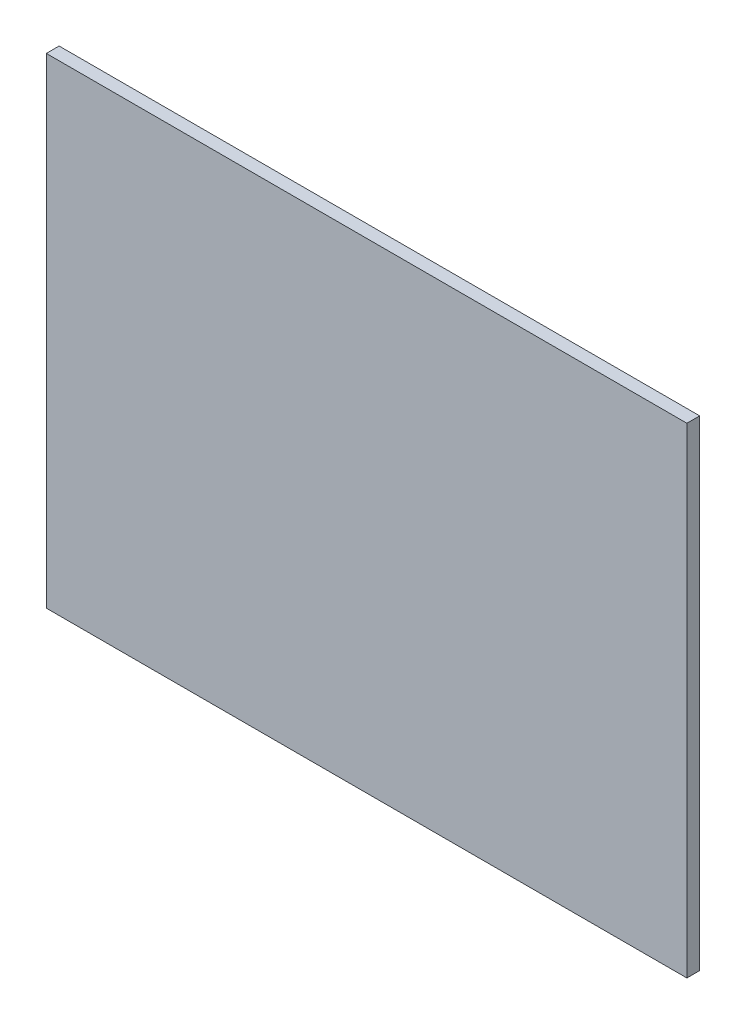
ISO-10303-21;
HEADER;
FILE_DESCRIPTION(('STEP AP214'),'2;1');
FILE_NAME('part.step','',(''),(''),'','','');
FILE_SCHEMA(('AUTOMOTIVE_DESIGN { 1 0 10303 214 1 1 1 1 }'));
ENDSEC;
DATA;
#1=APPLICATION_CONTEXT('core data for automotive mechanical design processes');
#2=APPLICATION_PROTOCOL_DEFINITION('international standard','automotive_design',2000,#1);
#3=PRODUCT_CONTEXT('',#1,'mechanical');
#4=PRODUCT('Part','Part','',(#3));
#5=PRODUCT_RELATED_PRODUCT_CATEGORY('part','',(#4));
#6=PRODUCT_DEFINITION_FORMATION('','',#4);
#7=PRODUCT_DEFINITION_CONTEXT('part definition',#1,'design');
#8=PRODUCT_DEFINITION('design','',#6,#7);
#9=PRODUCT_DEFINITION_SHAPE('','',#8);
#10=(LENGTH_UNIT() NAMED_UNIT(*) SI_UNIT(.MILLI.,.METRE.));
#11=(NAMED_UNIT(*) PLANE_ANGLE_UNIT() SI_UNIT($,.RADIAN.));
#12=(NAMED_UNIT(*) SI_UNIT($,.STERADIAN.) SOLID_ANGLE_UNIT());
#13=UNCERTAINTY_MEASURE_WITH_UNIT(LENGTH_MEASURE(1.E-05),#10,'distance_accuracy_value','');
#14=(GEOMETRIC_REPRESENTATION_CONTEXT(3) GLOBAL_UNCERTAINTY_ASSIGNED_CONTEXT((#13)) GLOBAL_UNIT_ASSIGNED_CONTEXT((#10,
#11,#12)) REPRESENTATION_CONTEXT('',''));
#15=CARTESIAN_POINT('',(0.,0.,0.));
#16=DIRECTION('',(0.,0.,1.));
#17=DIRECTION('',(1.,0.,0.));
#18=AXIS2_PLACEMENT_3D('',#15,#16,#17);
#19=CARTESIAN_POINT('',(250.,-187.5,10.));
#20=DIRECTION('',(-1.,0.,0.));
#21=DIRECTION('',(0.,0.,1.));
#22=AXIS2_PLACEMENT_3D('',#19,#20,#21);
#23=PLANE('',#22);
#24=DIRECTION('',(0.,1.,0.));
#25=VECTOR('',#24,1.);
#26=CARTESIAN_POINT('',(250.,-187.5,0.));
#27=LINE('',#26,#25);
#28=CARTESIAN_POINT('',(250.,-187.5,0.));
#29=VERTEX_POINT('',#28);
#30=CARTESIAN_POINT('',(250.,187.5,0.));
#31=VERTEX_POINT('',#30);
#32=EDGE_CURVE('E107',#29,#31,#27,.T.);
#33=ORIENTED_EDGE('',*,*,#32,.T.);
#34=DIRECTION('',(0.,0.,-1.));
#35=VECTOR('',#34,1.);
#36=CARTESIAN_POINT('',(250.,187.5,10.));
#37=LINE('',#36,#35);
#38=CARTESIAN_POINT('',(250.,187.5,10.));
#39=VERTEX_POINT('',#38);
#40=EDGE_CURVE('E11',#39,#31,#37,.T.);
#41=ORIENTED_EDGE('',*,*,#40,.F.);
#42=DIRECTION('',(0.,1.,0.));
#43=VECTOR('',#42,1.);
#44=CARTESIAN_POINT('',(250.,-187.5,10.));
#45=LINE('',#44,#43);
#46=CARTESIAN_POINT('',(250.,-187.5,10.));
#47=VERTEX_POINT('',#46);
#48=EDGE_CURVE('E91',#47,#39,#45,.T.);
#49=ORIENTED_EDGE('',*,*,#48,.F.);
#50=DIRECTION('',(0.,0.,-1.));
#51=VECTOR('',#50,1.);
#52=CARTESIAN_POINT('',(250.,-187.5,10.));
#53=LINE('',#52,#51);
#54=EDGE_CURVE('E103',#47,#29,#53,.T.);
#55=ORIENTED_EDGE('',*,*,#54,.T.);
#56=EDGE_LOOP('',(#33,#41,#49,#55));
#57=FACE_BOUND('',#56,.T.);
#58=ADVANCED_FACE('F39',(#57),#23,.F.);
#59=CARTESIAN_POINT('',(-250.,187.5,10.));
#60=DIRECTION('',(0.,-1.,0.));
#61=DIRECTION('',(0.,0.,-1.));
#62=AXIS2_PLACEMENT_3D('',#59,#60,#61);
#63=PLANE('',#62);
#64=DIRECTION('',(-1.,0.,0.));
#65=VECTOR('',#64,1.);
#66=CARTESIAN_POINT('',(-250.,187.5,0.));
#67=LINE('',#66,#65);
#68=CARTESIAN_POINT('',(-250.,187.5,0.));
#69=VERTEX_POINT('',#68);
#70=EDGE_CURVE('E96',#31,#69,#67,.T.);
#71=ORIENTED_EDGE('',*,*,#70,.T.);
#72=DIRECTION('',(0.,0.,-1.));
#73=VECTOR('',#72,1.);
#74=CARTESIAN_POINT('',(-250.,187.5,10.));
#75=LINE('',#74,#73);
#76=CARTESIAN_POINT('',(-250.,187.5,10.));
#77=VERTEX_POINT('',#76);
#78=EDGE_CURVE('E48',#77,#69,#75,.T.);
#79=ORIENTED_EDGE('',*,*,#78,.F.);
#80=DIRECTION('',(-1.,0.,0.));
#81=VECTOR('',#80,1.);
#82=CARTESIAN_POINT('',(-250.,187.5,10.));
#83=LINE('',#82,#81);
#84=EDGE_CURVE('E86',#39,#77,#83,.T.);
#85=ORIENTED_EDGE('',*,*,#84,.F.);
#86=ORIENTED_EDGE('',*,*,#40,.T.);
#87=EDGE_LOOP('',(#71,#79,#85,#86));
#88=FACE_BOUND('',#87,.T.);
#89=ADVANCED_FACE('F95',(#88),#63,.F.);
#90=CARTESIAN_POINT('',(-250.,-187.5,10.));
#91=DIRECTION('',(1.,0.,0.));
#92=DIRECTION('',(0.,0.,-1.));
#93=AXIS2_PLACEMENT_3D('',#90,#91,#92);
#94=PLANE('',#93);
#95=DIRECTION('',(0.,-1.,0.));
#96=VECTOR('',#95,1.);
#97=CARTESIAN_POINT('',(-250.,-187.5,0.));
#98=LINE('',#97,#96);
#99=CARTESIAN_POINT('',(-250.,-187.5,0.));
#100=VERTEX_POINT('',#99);
#101=EDGE_CURVE('E73',#69,#100,#98,.T.);
#102=ORIENTED_EDGE('',*,*,#101,.T.);
#103=DIRECTION('',(0.,0.,-1.));
#104=VECTOR('',#103,1.);
#105=CARTESIAN_POINT('',(-250.,-187.5,10.));
#106=LINE('',#105,#104);
#107=CARTESIAN_POINT('',(-250.,-187.5,10.));
#108=VERTEX_POINT('',#107);
#109=EDGE_CURVE('E98',#108,#100,#106,.T.);
#110=ORIENTED_EDGE('',*,*,#109,.F.);
#111=DIRECTION('',(0.,-1.,0.));
#112=VECTOR('',#111,1.);
#113=CARTESIAN_POINT('',(-250.,-187.5,10.));
#114=LINE('',#113,#112);
#115=EDGE_CURVE('E89',#77,#108,#114,.T.);
#116=ORIENTED_EDGE('',*,*,#115,.F.);
#117=ORIENTED_EDGE('',*,*,#78,.T.);
#118=EDGE_LOOP('',(#102,#110,#116,#117));
#119=FACE_BOUND('',#118,.T.);
#120=ADVANCED_FACE('F99',(#119),#94,.F.);
#121=CARTESIAN_POINT('',(-250.,-187.5,10.));
#122=DIRECTION('',(0.,1.,0.));
#123=DIRECTION('',(0.,0.,1.));
#124=AXIS2_PLACEMENT_3D('',#121,#122,#123);
#125=PLANE('',#124);
#126=DIRECTION('',(1.,0.,0.));
#127=VECTOR('',#126,1.);
#128=CARTESIAN_POINT('',(-250.,-187.5,0.));
#129=LINE('',#128,#127);
#130=EDGE_CURVE('E79',#100,#29,#129,.T.);
#131=ORIENTED_EDGE('',*,*,#130,.T.);
#132=ORIENTED_EDGE('',*,*,#54,.F.);
#133=DIRECTION('',(1.,0.,0.));
#134=VECTOR('',#133,1.);
#135=CARTESIAN_POINT('',(-250.,-187.5,10.));
#136=LINE('',#135,#134);
#137=EDGE_CURVE('E56',#108,#47,#136,.T.);
#138=ORIENTED_EDGE('',*,*,#137,.F.);
#139=ORIENTED_EDGE('',*,*,#109,.T.);
#140=EDGE_LOOP('',(#131,#132,#138,#139));
#141=FACE_BOUND('',#140,.T.);
#142=ADVANCED_FACE('F120',(#141),#125,.F.);
#143=CARTESIAN_POINT('',(0.,0.,10.));
#144=DIRECTION('',(0.,0.,-1.));
#145=DIRECTION('',(-1.,0.,0.));
#146=AXIS2_PLACEMENT_3D('',#143,#144,#145);
#147=PLANE('',#146);
#148=ORIENTED_EDGE('',*,*,#48,.T.);
#149=ORIENTED_EDGE('',*,*,#84,.T.);
#150=ORIENTED_EDGE('',*,*,#115,.T.);
#151=ORIENTED_EDGE('',*,*,#137,.T.);
#152=EDGE_LOOP('',(#148,#149,#150,#151));
#153=FACE_BOUND('',#152,.T.);
#154=ADVANCED_FACE('F87',(#153),#147,.F.);
#155=CARTESIAN_POINT('',(0.,0.,0.));
#156=DIRECTION('',(0.,0.,-1.));
#157=DIRECTION('',(-1.,0.,0.));
#158=AXIS2_PLACEMENT_3D('',#155,#156,#157);
#159=PLANE('',#158);
#160=ORIENTED_EDGE('',*,*,#32,.F.);
#161=ORIENTED_EDGE('',*,*,#130,.F.);
#162=ORIENTED_EDGE('',*,*,#101,.F.);
#163=ORIENTED_EDGE('',*,*,#70,.F.);
#164=EDGE_LOOP('',(#160,#161,#162,#163));
#165=FACE_BOUND('',#164,.T.);
#166=ADVANCED_FACE('F123',(#165),#159,.T.);
#167=CLOSED_SHELL('',(#58,#89,#120,#142,#154,#166));
#168=MANIFOLD_SOLID_BREP('B2',#167);
#169=ADVANCED_BREP_SHAPE_REPRESENTATION('',(#18,#168),#14);
#170=SHAPE_DEFINITION_REPRESENTATION(#9,#169);
ENDSEC;
END-ISO-10303-21;
